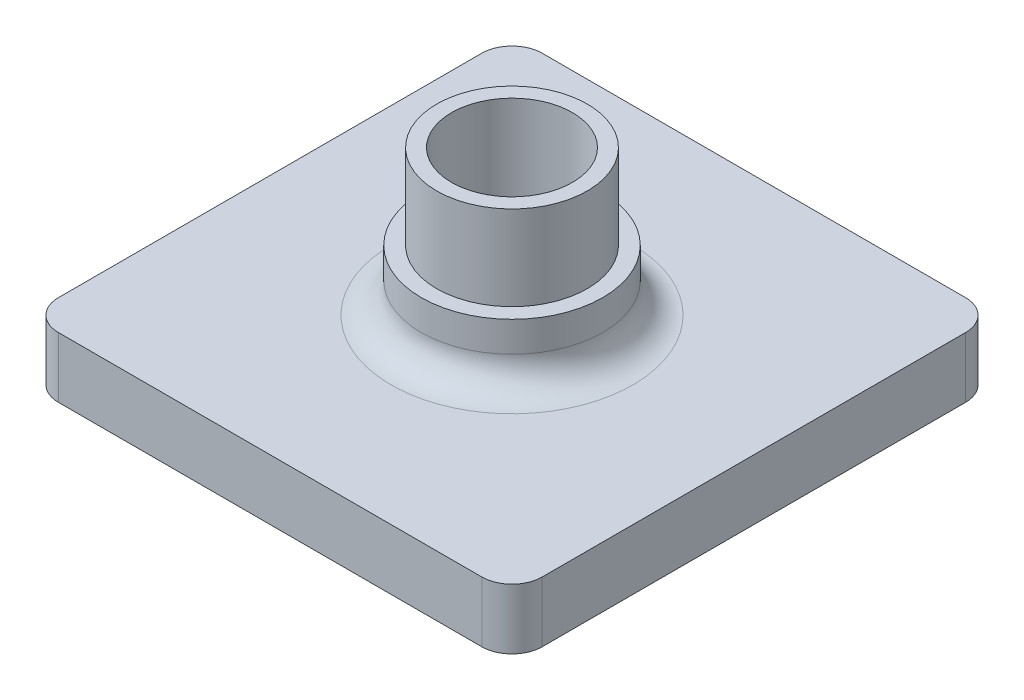
ISO-10303-21;
HEADER;
FILE_DESCRIPTION(('STEP AP214'),'2;1');
FILE_NAME('part.step','',(''),(''),'','','');
FILE_SCHEMA(('AUTOMOTIVE_DESIGN { 1 0 10303 214 1 1 1 1 }'));
ENDSEC;
DATA;
#1=APPLICATION_CONTEXT('core data for automotive mechanical design processes');
#2=APPLICATION_PROTOCOL_DEFINITION('international standard','automotive_design',2000,#1);
#3=PRODUCT_CONTEXT('',#1,'mechanical');
#4=PRODUCT('Part','Part','',(#3));
#5=PRODUCT_RELATED_PRODUCT_CATEGORY('part','',(#4));
#6=PRODUCT_DEFINITION_FORMATION('','',#4);
#7=PRODUCT_DEFINITION_CONTEXT('part definition',#1,'design');
#8=PRODUCT_DEFINITION('design','',#6,#7);
#9=PRODUCT_DEFINITION_SHAPE('','',#8);
#10=(LENGTH_UNIT() NAMED_UNIT(*) SI_UNIT(.MILLI.,.METRE.));
#11=(NAMED_UNIT(*) PLANE_ANGLE_UNIT() SI_UNIT($,.RADIAN.));
#12=(NAMED_UNIT(*) SI_UNIT($,.STERADIAN.) SOLID_ANGLE_UNIT());
#13=UNCERTAINTY_MEASURE_WITH_UNIT(LENGTH_MEASURE(1.E-05),#10,'distance_accuracy_value','');
#14=(GEOMETRIC_REPRESENTATION_CONTEXT(3) GLOBAL_UNCERTAINTY_ASSIGNED_CONTEXT((#13)) GLOBAL_UNIT_ASSIGNED_CONTEXT((#10,
#11,#12)) REPRESENTATION_CONTEXT('',''));
#15=CARTESIAN_POINT('',(0.,0.,0.));
#16=DIRECTION('',(0.,0.,1.));
#17=DIRECTION('',(1.,0.,0.));
#18=AXIS2_PLACEMENT_3D('',#15,#16,#17);
#19=CARTESIAN_POINT('',(20.,5.,20.));
#20=DIRECTION('',(-1.,0.,0.));
#21=DIRECTION('',(0.,0.,1.));
#22=AXIS2_PLACEMENT_3D('',#19,#20,#21);
#23=PLANE('',#22);
#24=DIRECTION('',(0.,0.,-1.));
#25=VECTOR('',#24,1.);
#26=CARTESIAN_POINT('',(20.,0.,20.));
#27=LINE('',#26,#25);
#28=CARTESIAN_POINT('',(20.,0.,17.5));
#29=VERTEX_POINT('',#28);
#30=CARTESIAN_POINT('',(20.,0.,-17.5));
#31=VERTEX_POINT('',#30);
#32=EDGE_CURVE('E160',#29,#31,#27,.T.);
#33=ORIENTED_EDGE('',*,*,#32,.T.);
#34=DIRECTION('',(0.,-1.,0.));
#35=VECTOR('',#34,1.);
#36=CARTESIAN_POINT('',(20.,5.,-17.5));
#37=LINE('',#36,#35);
#38=CARTESIAN_POINT('',(20.,5.,-17.5));
#39=VERTEX_POINT('',#38);
#40=EDGE_CURVE('E11',#31,#39,#37,.F.);
#41=ORIENTED_EDGE('',*,*,#40,.T.);
#42=DIRECTION('',(0.,0.,-1.));
#43=VECTOR('',#42,1.);
#44=CARTESIAN_POINT('',(20.,5.,20.));
#45=LINE('',#44,#43);
#46=CARTESIAN_POINT('',(20.,5.,17.5));
#47=VERTEX_POINT('',#46);
#48=EDGE_CURVE('E104',#47,#39,#45,.T.);
#49=ORIENTED_EDGE('',*,*,#48,.F.);
#50=DIRECTION('',(0.,-1.,0.));
#51=VECTOR('',#50,1.);
#52=CARTESIAN_POINT('',(20.,5.,17.5));
#53=LINE('',#52,#51);
#54=EDGE_CURVE('E41',#47,#29,#53,.T.);
#55=ORIENTED_EDGE('',*,*,#54,.T.);
#56=EDGE_LOOP('',(#33,#41,#49,#55));
#57=FACE_BOUND('',#56,.T.);
#58=ADVANCED_FACE('F33',(#57),#23,.F.);
#59=CARTESIAN_POINT('',(-20.,5.,-20.));
#60=DIRECTION('',(0.,0.,1.));
#61=DIRECTION('',(1.,0.,0.));
#62=AXIS2_PLACEMENT_3D('',#59,#60,#61);
#63=PLANE('',#62);
#64=DIRECTION('',(-1.,0.,0.));
#65=VECTOR('',#64,1.);
#66=CARTESIAN_POINT('',(-20.,0.,-20.));
#67=LINE('',#66,#65);
#68=CARTESIAN_POINT('',(17.5,0.,-20.));
#69=VERTEX_POINT('',#68);
#70=CARTESIAN_POINT('',(-17.5,0.,-20.));
#71=VERTEX_POINT('',#70);
#72=EDGE_CURVE('E158',#69,#71,#67,.T.);
#73=ORIENTED_EDGE('',*,*,#72,.T.);
#74=DIRECTION('',(0.,-1.,0.));
#75=VECTOR('',#74,1.);
#76=CARTESIAN_POINT('',(-17.5,5.,-20.));
#77=LINE('',#76,#75);
#78=CARTESIAN_POINT('',(-17.5,5.,-20.));
#79=VERTEX_POINT('',#78);
#80=EDGE_CURVE('E122',#71,#79,#77,.F.);
#81=ORIENTED_EDGE('',*,*,#80,.T.);
#82=DIRECTION('',(-1.,0.,0.));
#83=VECTOR('',#82,1.);
#84=CARTESIAN_POINT('',(-20.,5.,-20.));
#85=LINE('',#84,#83);
#86=CARTESIAN_POINT('',(17.5,5.,-20.));
#87=VERTEX_POINT('',#86);
#88=EDGE_CURVE('E118',#87,#79,#85,.T.);
#89=ORIENTED_EDGE('',*,*,#88,.F.);
#90=DIRECTION('',(0.,-1.,0.));
#91=VECTOR('',#90,1.);
#92=CARTESIAN_POINT('',(17.5,5.,-20.));
#93=LINE('',#92,#91);
#94=EDGE_CURVE('E123',#87,#69,#93,.T.);
#95=ORIENTED_EDGE('',*,*,#94,.T.);
#96=EDGE_LOOP('',(#73,#81,#89,#95));
#97=FACE_BOUND('',#96,.T.);
#98=ADVANCED_FACE('F219',(#97),#63,.F.);
#99=CARTESIAN_POINT('',(-20.,5.,20.));
#100=DIRECTION('',(1.,0.,0.));
#101=DIRECTION('',(0.,0.,-1.));
#102=AXIS2_PLACEMENT_3D('',#99,#100,#101);
#103=PLANE('',#102);
#104=DIRECTION('',(0.,0.,1.));
#105=VECTOR('',#104,1.);
#106=CARTESIAN_POINT('',(-20.,0.,20.));
#107=LINE('',#106,#105);
#108=CARTESIAN_POINT('',(-20.,0.,-17.5));
#109=VERTEX_POINT('',#108);
#110=CARTESIAN_POINT('',(-20.,0.,17.5));
#111=VERTEX_POINT('',#110);
#112=EDGE_CURVE('E155',#109,#111,#107,.T.);
#113=ORIENTED_EDGE('',*,*,#112,.T.);
#114=DIRECTION('',(0.,-1.,0.));
#115=VECTOR('',#114,1.);
#116=CARTESIAN_POINT('',(-20.,5.,17.5));
#117=LINE('',#116,#115);
#118=CARTESIAN_POINT('',(-20.,5.,17.5));
#119=VERTEX_POINT('',#118);
#120=EDGE_CURVE('E127',#111,#119,#117,.F.);
#121=ORIENTED_EDGE('',*,*,#120,.T.);
#122=DIRECTION('',(0.,0.,1.));
#123=VECTOR('',#122,1.);
#124=CARTESIAN_POINT('',(-20.,5.,20.));
#125=LINE('',#124,#123);
#126=CARTESIAN_POINT('',(-20.,5.,-17.5));
#127=VERTEX_POINT('',#126);
#128=EDGE_CURVE('E164',#127,#119,#125,.T.);
#129=ORIENTED_EDGE('',*,*,#128,.F.);
#130=DIRECTION('',(0.,-1.,0.));
#131=VECTOR('',#130,1.);
#132=CARTESIAN_POINT('',(-20.,5.,-17.5));
#133=LINE('',#132,#131);
#134=EDGE_CURVE('E129',#127,#109,#133,.T.);
#135=ORIENTED_EDGE('',*,*,#134,.T.);
#136=EDGE_LOOP('',(#113,#121,#129,#135));
#137=FACE_BOUND('',#136,.T.);
#138=ADVANCED_FACE('F224',(#137),#103,.F.);
#139=CARTESIAN_POINT('',(-20.,5.,20.));
#140=DIRECTION('',(0.,0.,-1.));
#141=DIRECTION('',(-1.,0.,0.));
#142=AXIS2_PLACEMENT_3D('',#139,#140,#141);
#143=PLANE('',#142);
#144=DIRECTION('',(1.,0.,0.));
#145=VECTOR('',#144,1.);
#146=CARTESIAN_POINT('',(-20.,5.,20.));
#147=LINE('',#146,#145);
#148=CARTESIAN_POINT('',(-17.5,5.,20.));
#149=VERTEX_POINT('',#148);
#150=CARTESIAN_POINT('',(17.5,5.,20.));
#151=VERTEX_POINT('',#150);
#152=EDGE_CURVE('E107',#149,#151,#147,.T.);
#153=ORIENTED_EDGE('',*,*,#152,.F.);
#154=DIRECTION('',(0.,-1.,0.));
#155=VECTOR('',#154,1.);
#156=CARTESIAN_POINT('',(-17.5,5.,20.));
#157=LINE('',#156,#155);
#158=CARTESIAN_POINT('',(-17.5,0.,20.));
#159=VERTEX_POINT('',#158);
#160=EDGE_CURVE('E137',#149,#159,#157,.T.);
#161=ORIENTED_EDGE('',*,*,#160,.T.);
#162=DIRECTION('',(1.,0.,0.));
#163=VECTOR('',#162,1.);
#164=CARTESIAN_POINT('',(-20.,0.,20.));
#165=LINE('',#164,#163);
#166=CARTESIAN_POINT('',(17.5,0.,20.));
#167=VERTEX_POINT('',#166);
#168=EDGE_CURVE('E119',#159,#167,#165,.T.);
#169=ORIENTED_EDGE('',*,*,#168,.T.);
#170=DIRECTION('',(0.,-1.,0.));
#171=VECTOR('',#170,1.);
#172=CARTESIAN_POINT('',(17.5,5.,20.));
#173=LINE('',#172,#171);
#174=EDGE_CURVE('E140',#167,#151,#173,.F.);
#175=ORIENTED_EDGE('',*,*,#174,.T.);
#176=EDGE_LOOP('',(#153,#161,#169,#175));
#177=FACE_BOUND('',#176,.T.);
#178=ADVANCED_FACE('F254',(#177),#143,.F.);
#179=CARTESIAN_POINT('',(0.,5.,0.));
#180=DIRECTION('',(0.,-1.,0.));
#181=DIRECTION('',(0.,0.,-1.));
#182=AXIS2_PLACEMENT_3D('',#179,#180,#181);
#183=PLANE('',#182);
#184=CARTESIAN_POINT('',(0.,5.,0.));
#185=DIRECTION('',(0.,-1.,0.));
#186=DIRECTION('',(0.,0.,-1.));
#187=AXIS2_PLACEMENT_3D('',#184,#185,#186);
#188=CIRCLE('',#187,10.);
#189=CARTESIAN_POINT('',(0.,5.,-10.));
#190=VERTEX_POINT('',#189);
#191=EDGE_CURVE('E142',#190,#190,#188,.T.);
#192=ORIENTED_EDGE('',*,*,#191,.T.);
#193=EDGE_LOOP('',(#192));
#194=FACE_BOUND('',#193,.T.);
#195=ORIENTED_EDGE('',*,*,#128,.T.);
#196=CARTESIAN_POINT('',(-17.5,5.,17.5));
#197=DIRECTION('',(0.,-1.,0.));
#198=DIRECTION('',(0.,0.,-1.));
#199=AXIS2_PLACEMENT_3D('',#196,#197,#198);
#200=CIRCLE('',#199,2.5);
#201=EDGE_CURVE('E145',#119,#149,#200,.F.);
#202=ORIENTED_EDGE('',*,*,#201,.T.);
#203=ORIENTED_EDGE('',*,*,#152,.T.);
#204=CARTESIAN_POINT('',(17.5,5.,17.5));
#205=DIRECTION('',(0.,-1.,0.));
#206=DIRECTION('',(0.,0.,-1.));
#207=AXIS2_PLACEMENT_3D('',#204,#205,#206);
#208=CIRCLE('',#207,2.5);
#209=EDGE_CURVE('E100',#151,#47,#208,.F.);
#210=ORIENTED_EDGE('',*,*,#209,.T.);
#211=ORIENTED_EDGE('',*,*,#48,.T.);
#212=CARTESIAN_POINT('',(17.5,5.,-17.5));
#213=DIRECTION('',(0.,-1.,0.));
#214=DIRECTION('',(0.,0.,-1.));
#215=AXIS2_PLACEMENT_3D('',#212,#213,#214);
#216=CIRCLE('',#215,2.5);
#217=EDGE_CURVE('E111',#39,#87,#216,.F.);
#218=ORIENTED_EDGE('',*,*,#217,.T.);
#219=ORIENTED_EDGE('',*,*,#88,.T.);
#220=CARTESIAN_POINT('',(-17.5,5.,-17.5));
#221=DIRECTION('',(0.,-1.,0.));
#222=DIRECTION('',(0.,0.,-1.));
#223=AXIS2_PLACEMENT_3D('',#220,#221,#222);
#224=CIRCLE('',#223,2.5);
#225=EDGE_CURVE('E147',#79,#127,#224,.F.);
#226=ORIENTED_EDGE('',*,*,#225,.T.);
#227=EDGE_LOOP('',(#195,#202,#203,#210,#211,#218,#219,#226));
#228=FACE_BOUND('',#227,.T.);
#229=ADVANCED_FACE('F103',(#194,#228),#183,.F.);
#230=CARTESIAN_POINT('',(0.,0.,0.));
#231=DIRECTION('',(0.,-1.,0.));
#232=DIRECTION('',(0.,0.,-1.));
#233=AXIS2_PLACEMENT_3D('',#230,#231,#232);
#234=PLANE('',#233);
#235=CARTESIAN_POINT('',(0.,0.,0.));
#236=DIRECTION('',(0.,1.,0.));
#237=DIRECTION('',(0.,0.,1.));
#238=AXIS2_PLACEMENT_3D('',#235,#236,#237);
#239=CIRCLE('',#238,5.);
#240=CARTESIAN_POINT('',(0.,0.,5.));
#241=VERTEX_POINT('',#240);
#242=EDGE_CURVE('E175',#241,#241,#239,.T.);
#243=ORIENTED_EDGE('',*,*,#242,.T.);
#244=EDGE_LOOP('',(#243));
#245=FACE_BOUND('',#244,.T.);
#246=ORIENTED_EDGE('',*,*,#168,.F.);
#247=CARTESIAN_POINT('',(-17.5,0.,17.5));
#248=DIRECTION('',(0.,-1.,0.));
#249=DIRECTION('',(0.,0.,-1.));
#250=AXIS2_PLACEMENT_3D('',#247,#248,#249);
#251=CIRCLE('',#250,2.5);
#252=EDGE_CURVE('E132',#159,#111,#251,.T.);
#253=ORIENTED_EDGE('',*,*,#252,.T.);
#254=ORIENTED_EDGE('',*,*,#112,.F.);
#255=CARTESIAN_POINT('',(-17.5,0.,-17.5));
#256=DIRECTION('',(0.,-1.,0.));
#257=DIRECTION('',(0.,0.,-1.));
#258=AXIS2_PLACEMENT_3D('',#255,#256,#257);
#259=CIRCLE('',#258,2.5);
#260=EDGE_CURVE('E48',#109,#71,#259,.T.);
#261=ORIENTED_EDGE('',*,*,#260,.T.);
#262=ORIENTED_EDGE('',*,*,#72,.F.);
#263=CARTESIAN_POINT('',(17.5,0.,-17.5));
#264=DIRECTION('',(0.,-1.,0.));
#265=DIRECTION('',(0.,0.,-1.));
#266=AXIS2_PLACEMENT_3D('',#263,#264,#265);
#267=CIRCLE('',#266,2.5);
#268=EDGE_CURVE('E56',#69,#31,#267,.T.);
#269=ORIENTED_EDGE('',*,*,#268,.T.);
#270=ORIENTED_EDGE('',*,*,#32,.F.);
#271=CARTESIAN_POINT('',(17.5,0.,17.5));
#272=DIRECTION('',(0.,-1.,0.));
#273=DIRECTION('',(0.,0.,-1.));
#274=AXIS2_PLACEMENT_3D('',#271,#272,#273);
#275=CIRCLE('',#274,2.5);
#276=EDGE_CURVE('E121',#29,#167,#275,.T.);
#277=ORIENTED_EDGE('',*,*,#276,.T.);
#278=EDGE_LOOP('',(#246,#253,#254,#261,#262,#269,#270,#277));
#279=FACE_BOUND('',#278,.T.);
#280=ADVANCED_FACE('F182',(#245,#279),#234,.T.);
#281=CARTESIAN_POINT('',(0.,10.,0.));
#282=DIRECTION('',(0.,-1.,0.));
#283=DIRECTION('',(0.,0.,-1.));
#284=AXIS2_PLACEMENT_3D('',#281,#282,#283);
#285=CYLINDRICAL_SURFACE('',#284,7.5);
#286=CARTESIAN_POINT('',(0.,7.5,0.));
#287=DIRECTION('',(0.,-1.,0.));
#288=DIRECTION('',(0.,0.,-1.));
#289=AXIS2_PLACEMENT_3D('',#286,#287,#288);
#290=CIRCLE('',#289,7.5);
#291=CARTESIAN_POINT('',(0.,7.5,-7.5));
#292=VERTEX_POINT('',#291);
#293=EDGE_CURVE('E112',#292,#292,#290,.F.);
#294=ORIENTED_EDGE('',*,*,#293,.T.);
#295=EDGE_LOOP('',(#294));
#296=FACE_BOUND('',#295,.T.);
#297=CARTESIAN_POINT('',(0.,10.,0.));
#298=DIRECTION('',(0.,1.,0.));
#299=DIRECTION('',(0.,0.,1.));
#300=AXIS2_PLACEMENT_3D('',#297,#298,#299);
#301=CIRCLE('',#300,7.5);
#302=CARTESIAN_POINT('',(0.,10.,7.5));
#303=VERTEX_POINT('',#302);
#304=EDGE_CURVE('E162',#303,#303,#301,.T.);
#305=ORIENTED_EDGE('',*,*,#304,.F.);
#306=EDGE_LOOP('',(#305));
#307=FACE_BOUND('',#306,.T.);
#308=ADVANCED_FACE('F206',(#296,#307),#285,.T.);
#309=CARTESIAN_POINT('',(0.,10.,0.));
#310=DIRECTION('',(0.,1.,0.));
#311=DIRECTION('',(0.,0.,1.));
#312=AXIS2_PLACEMENT_3D('',#309,#310,#311);
#313=PLANE('',#312);
#314=CARTESIAN_POINT('',(0.,10.,0.));
#315=DIRECTION('',(0.,1.,0.));
#316=DIRECTION('',(0.,0.,1.));
#317=AXIS2_PLACEMENT_3D('',#314,#315,#316);
#318=CIRCLE('',#317,6.225);
#319=CARTESIAN_POINT('',(0.,10.,6.225));
#320=VERTEX_POINT('',#319);
#321=EDGE_CURVE('E152',#320,#320,#318,.T.);
#322=ORIENTED_EDGE('',*,*,#321,.F.);
#323=EDGE_LOOP('',(#322));
#324=FACE_BOUND('',#323,.T.);
#325=ORIENTED_EDGE('',*,*,#304,.T.);
#326=EDGE_LOOP('',(#325));
#327=FACE_BOUND('',#326,.T.);
#328=ADVANCED_FACE('F200',(#324,#327),#313,.T.);
#329=CARTESIAN_POINT('',(0.,17.,0.));
#330=DIRECTION('',(0.,-1.,0.));
#331=DIRECTION('',(0.,0.,-1.));
#332=AXIS2_PLACEMENT_3D('',#329,#330,#331);
#333=CYLINDRICAL_SURFACE('',#332,6.225);
#334=CARTESIAN_POINT('',(0.,17.,0.));
#335=DIRECTION('',(0.,1.,0.));
#336=DIRECTION('',(0.,0.,1.));
#337=AXIS2_PLACEMENT_3D('',#334,#335,#336);
#338=CIRCLE('',#337,6.225);
#339=CARTESIAN_POINT('',(0.,17.,6.225));
#340=VERTEX_POINT('',#339);
#341=EDGE_CURVE('E170',#340,#340,#338,.T.);
#342=ORIENTED_EDGE('',*,*,#341,.F.);
#343=EDGE_LOOP('',(#342));
#344=FACE_BOUND('',#343,.T.);
#345=ORIENTED_EDGE('',*,*,#321,.T.);
#346=EDGE_LOOP('',(#345));
#347=FACE_BOUND('',#346,.T.);
#348=ADVANCED_FACE('F194',(#344,#347),#333,.T.);
#349=CARTESIAN_POINT('',(0.,17.,0.));
#350=DIRECTION('',(0.,1.,0.));
#351=DIRECTION('',(0.,0.,1.));
#352=AXIS2_PLACEMENT_3D('',#349,#350,#351);
#353=PLANE('',#352);
#354=CARTESIAN_POINT('',(0.,17.,0.));
#355=DIRECTION('',(0.,1.,0.));
#356=DIRECTION('',(0.,0.,1.));
#357=AXIS2_PLACEMENT_3D('',#354,#355,#356);
#358=CIRCLE('',#357,5.);
#359=CARTESIAN_POINT('',(0.,17.,5.));
#360=VERTEX_POINT('',#359);
#361=EDGE_CURVE('E176',#360,#360,#358,.T.);
#362=ORIENTED_EDGE('',*,*,#361,.F.);
#363=EDGE_LOOP('',(#362));
#364=FACE_BOUND('',#363,.T.);
#365=ORIENTED_EDGE('',*,*,#341,.T.);
#366=EDGE_LOOP('',(#365));
#367=FACE_BOUND('',#366,.T.);
#368=ADVANCED_FACE('F190',(#364,#367),#353,.T.);
#369=CARTESIAN_POINT('',(0.,7.5,0.));
#370=DIRECTION('',(0.,-1.,0.));
#371=DIRECTION('',(0.,0.,-1.));
#372=AXIS2_PLACEMENT_3D('',#369,#370,#371);
#373=TOROIDAL_SURFACE('',#372,10.,2.5);
#374=ORIENTED_EDGE('',*,*,#191,.F.);
#375=EDGE_LOOP('',(#374));
#376=FACE_BOUND('',#375,.T.);
#377=ORIENTED_EDGE('',*,*,#293,.F.);
#378=EDGE_LOOP('',(#377));
#379=FACE_BOUND('',#378,.T.);
#380=ADVANCED_FACE('F193',(#376,#379),#373,.F.);
#381=CARTESIAN_POINT('',(-17.5,5.,17.5));
#382=DIRECTION('',(0.,-1.,0.));
#383=DIRECTION('',(0.,0.,-1.));
#384=AXIS2_PLACEMENT_3D('',#381,#382,#383);
#385=CYLINDRICAL_SURFACE('',#384,2.5);
#386=ORIENTED_EDGE('',*,*,#201,.F.);
#387=ORIENTED_EDGE('',*,*,#120,.F.);
#388=ORIENTED_EDGE('',*,*,#252,.F.);
#389=ORIENTED_EDGE('',*,*,#160,.F.);
#390=EDGE_LOOP('',(#386,#387,#388,#389));
#391=FACE_BOUND('',#390,.T.);
#392=ADVANCED_FACE('F231',(#391),#385,.T.);
#393=CARTESIAN_POINT('',(-17.5,5.,-17.5));
#394=DIRECTION('',(0.,-1.,0.));
#395=DIRECTION('',(0.,0.,-1.));
#396=AXIS2_PLACEMENT_3D('',#393,#394,#395);
#397=CYLINDRICAL_SURFACE('',#396,2.5);
#398=ORIENTED_EDGE('',*,*,#225,.F.);
#399=ORIENTED_EDGE('',*,*,#80,.F.);
#400=ORIENTED_EDGE('',*,*,#260,.F.);
#401=ORIENTED_EDGE('',*,*,#134,.F.);
#402=EDGE_LOOP('',(#398,#399,#400,#401));
#403=FACE_BOUND('',#402,.T.);
#404=ADVANCED_FACE('F235',(#403),#397,.T.);
#405=CARTESIAN_POINT('',(17.5,5.,-17.5));
#406=DIRECTION('',(0.,-1.,0.));
#407=DIRECTION('',(0.,0.,-1.));
#408=AXIS2_PLACEMENT_3D('',#405,#406,#407);
#409=CYLINDRICAL_SURFACE('',#408,2.5);
#410=ORIENTED_EDGE('',*,*,#217,.F.);
#411=ORIENTED_EDGE('',*,*,#40,.F.);
#412=ORIENTED_EDGE('',*,*,#268,.F.);
#413=ORIENTED_EDGE('',*,*,#94,.F.);
#414=EDGE_LOOP('',(#410,#411,#412,#413));
#415=FACE_BOUND('',#414,.T.);
#416=ADVANCED_FACE('F238',(#415),#409,.T.);
#417=CARTESIAN_POINT('',(17.5,5.,17.5));
#418=DIRECTION('',(0.,-1.,0.));
#419=DIRECTION('',(0.,0.,-1.));
#420=AXIS2_PLACEMENT_3D('',#417,#418,#419);
#421=CYLINDRICAL_SURFACE('',#420,2.5);
#422=ORIENTED_EDGE('',*,*,#209,.F.);
#423=ORIENTED_EDGE('',*,*,#174,.F.);
#424=ORIENTED_EDGE('',*,*,#276,.F.);
#425=ORIENTED_EDGE('',*,*,#54,.F.);
#426=EDGE_LOOP('',(#422,#423,#424,#425));
#427=FACE_BOUND('',#426,.T.);
#428=ADVANCED_FACE('F35',(#427),#421,.T.);
#429=CARTESIAN_POINT('',(0.,0.,0.));
#430=DIRECTION('',(0.,1.,0.));
#431=DIRECTION('',(0.,0.,1.));
#432=AXIS2_PLACEMENT_3D('',#429,#430,#431);
#433=CYLINDRICAL_SURFACE('',#432,5.);
#434=ORIENTED_EDGE('',*,*,#242,.F.);
#435=EDGE_LOOP('',(#434));
#436=FACE_BOUND('',#435,.T.);
#437=ORIENTED_EDGE('',*,*,#361,.T.);
#438=EDGE_LOOP('',(#437));
#439=FACE_BOUND('',#438,.T.);
#440=ADVANCED_FACE('F184',(#436,#439),#433,.F.);
#441=CLOSED_SHELL('',(#58,#98,#138,#178,#229,#280,#308,#328,#348,#368,#380,#392,#404,#416,#428,#440));
#442=MANIFOLD_SOLID_BREP('B2',#441);
#443=ADVANCED_BREP_SHAPE_REPRESENTATION('',(#18,#442),#14);
#444=SHAPE_DEFINITION_REPRESENTATION(#9,#443);
ENDSEC;
END-ISO-10303-21;
